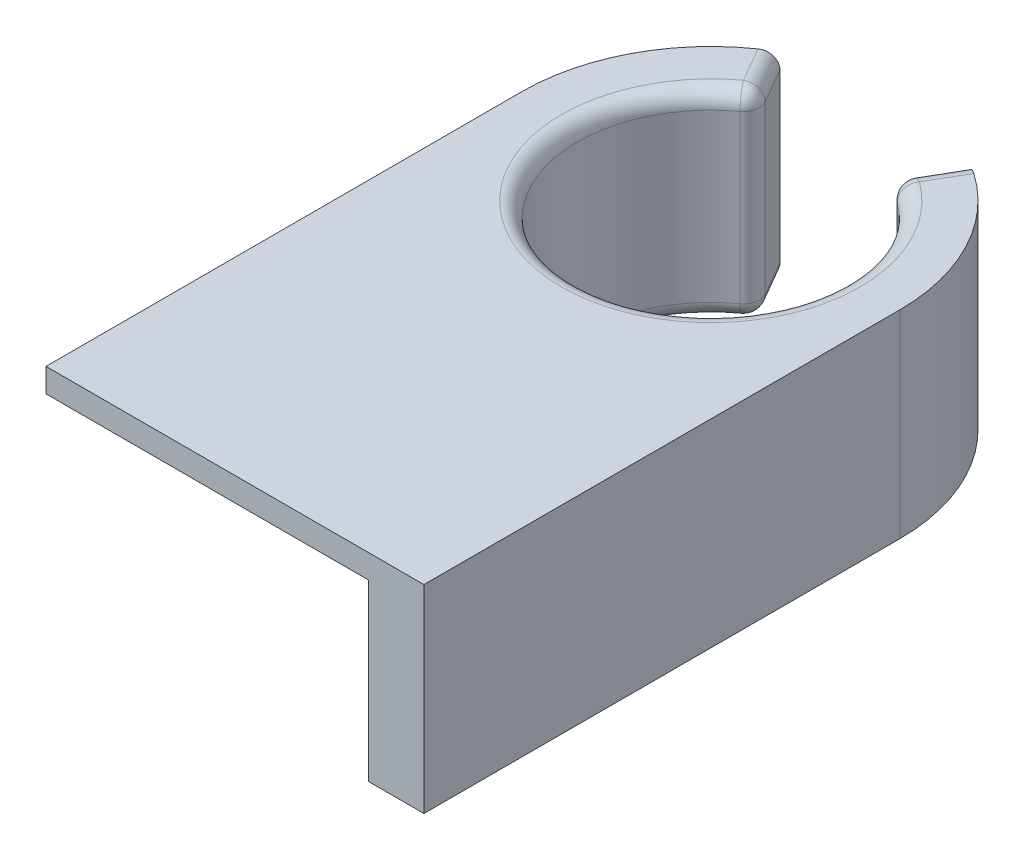
ISO-10303-21;
HEADER;
FILE_DESCRIPTION(('STEP AP214'),'2;1');
FILE_NAME('part.step','',(''),(''),'','','');
FILE_SCHEMA(('AUTOMOTIVE_DESIGN { 1 0 10303 214 1 1 1 1 }'));
ENDSEC;
DATA;
#1=APPLICATION_CONTEXT('core data for automotive mechanical design processes');
#2=APPLICATION_PROTOCOL_DEFINITION('international standard','automotive_design',2000,#1);
#3=PRODUCT_CONTEXT('',#1,'mechanical');
#4=PRODUCT('Part','Part','',(#3));
#5=PRODUCT_RELATED_PRODUCT_CATEGORY('part','',(#4));
#6=PRODUCT_DEFINITION_FORMATION('','',#4);
#7=PRODUCT_DEFINITION_CONTEXT('part definition',#1,'design');
#8=PRODUCT_DEFINITION('design','',#6,#7);
#9=PRODUCT_DEFINITION_SHAPE('','',#8);
#10=(LENGTH_UNIT() NAMED_UNIT(*) SI_UNIT(.MILLI.,.METRE.));
#11=(NAMED_UNIT(*) PLANE_ANGLE_UNIT() SI_UNIT($,.RADIAN.));
#12=(NAMED_UNIT(*) SI_UNIT($,.STERADIAN.) SOLID_ANGLE_UNIT());
#13=UNCERTAINTY_MEASURE_WITH_UNIT(LENGTH_MEASURE(1.E-05),#10,'distance_accuracy_value','');
#14=(GEOMETRIC_REPRESENTATION_CONTEXT(3) GLOBAL_UNCERTAINTY_ASSIGNED_CONTEXT((#13)) GLOBAL_UNIT_ASSIGNED_CONTEXT((#10,
#11,#12)) REPRESENTATION_CONTEXT('',''));
#15=CARTESIAN_POINT('',(0.,0.,0.));
#16=DIRECTION('',(0.,0.,1.));
#17=DIRECTION('',(1.,0.,0.));
#18=AXIS2_PLACEMENT_3D('',#15,#16,#17);
#19=CARTESIAN_POINT('',(0.,25.,0.));
#20=DIRECTION('',(0.,-1.,0.));
#21=DIRECTION('',(0.,0.,-1.));
#22=AXIS2_PLACEMENT_3D('',#19,#20,#21);
#23=CYLINDRICAL_SURFACE('',#22,23.8275);
#24=CARTESIAN_POINT('',(0.,25.,0.));
#25=DIRECTION('',(0.,1.,0.));
#26=DIRECTION('',(0.,0.,1.));
#27=AXIS2_PLACEMENT_3D('',#24,#25,#26);
#28=CIRCLE('',#27,23.8275);
#29=CARTESIAN_POINT('',(-13.6037583116519,25.,-19.5624005696684));
#30=VERTEX_POINT('',#29);
#31=CARTESIAN_POINT('',(-23.8275,25.,1.6638654320257E-13));
#32=VERTEX_POINT('',#31);
#33=EDGE_CURVE('E253',#30,#32,#28,.T.);
#34=ORIENTED_EDGE('',*,*,#33,.F.);
#35=CARTESIAN_POINT('',(-13.6037583116519,25.,-19.5624005696684));
#36=CARTESIAN_POINT('',(-13.5575772462199,24.9999996346999,-19.594516376713));
#37=CARTESIAN_POINT('',(-13.5113026803876,24.997642113347,-19.6264515947386));
#38=CARTESIAN_POINT('',(-13.4188576270536,24.9882285596995,-19.6897726748416));
#39=CARTESIAN_POINT('',(-13.3726871369803,24.9811726448012,-19.7211585506252));
#40=CARTESIAN_POINT('',(-13.2349123051829,24.9530109636435,-19.8141128594237));
#41=CARTESIAN_POINT('',(-13.1438946776167,24.924911134737,-19.8745821423708));
#42=CARTESIAN_POINT('',(-12.9663012669855,24.85078591658,-19.9909003303027));
#43=CARTESIAN_POINT('',(-12.8797281462278,24.8047499219538,-20.0467464779683));
#44=CARTESIAN_POINT('',(-12.7136814181872,24.6960408797662,-20.1524626180716));
#45=CARTESIAN_POINT('',(-12.6342063097434,24.6333713612226,-20.2023338749062));
#46=CARTESIAN_POINT('',(-12.484960572036,24.4932969970803,-20.2949065264269));
#47=CARTESIAN_POINT('',(-12.4151722410985,24.4159196587558,-20.3376210298099));
#48=CARTESIAN_POINT('',(-12.2872980860975,24.248524534077,-20.4151332911205));
#49=CARTESIAN_POINT('',(-12.2292147157592,24.1585041040338,-20.4499293893004));
#50=CARTESIAN_POINT('',(-12.1265635163451,23.9683041661146,-20.510967716837));
#51=CARTESIAN_POINT('',(-12.0820091591658,23.8681146636583,-20.5372014218825));
#52=CARTESIAN_POINT('',(-12.0079378677457,23.6605030597029,-20.5805985828272));
#53=CARTESIAN_POINT('',(-11.9784123864129,23.5530851085507,-20.5977671943557));
#54=CARTESIAN_POINT('',(-11.942551038963,23.3708640523362,-20.6185718432068));
#55=CARTESIAN_POINT('',(-11.9317598305681,23.2971936337727,-20.6248147350633));
#56=CARTESIAN_POINT('',(-11.9173588510578,23.1490256754823,-20.6331367803596));
#57=CARTESIAN_POINT('',(-11.9137391101299,23.0745294290139,-20.6352217142415));
#58=CARTESIAN_POINT('',(-11.91375,23.,-20.6352203086737));
#59=B_SPLINE_CURVE_WITH_KNOTS('',3,(#35,#36,#37,#38,#39,#40,#41,#42,#43,#44,#45,#46,#47,#48,#49,
#50,#51,#52,#53,#54,#55,#56,#57,#58),.UNSPECIFIED.,.F.,.F.,(4,2,2,2,2,2,2,2,2,2,2,4),(0.,
0.168648988617177,0.337293763445205,0.674042585233094,1.01099082428119,1.3478676324548,
1.68412048855518,2.02044376058942,2.35710084596817,2.69356625612903,2.91728429674187,
3.14069110448448),.UNSPECIFIED.);
#60=CARTESIAN_POINT('',(-11.91375,23.,-20.6352203086737));
#61=VERTEX_POINT('',#60);
#62=EDGE_CURVE('E344',#30,#61,#59,.T.);
#63=ORIENTED_EDGE('',*,*,#62,.T.);
#64=DIRECTION('',(0.,-1.,0.));
#65=VECTOR('',#64,1.);
#66=CARTESIAN_POINT('',(-11.91375,25.,-20.6352203086737));
#67=LINE('',#66,#65);
#68=CARTESIAN_POINT('',(-11.91375,2.,-20.6352203086737));
#69=VERTEX_POINT('',#68);
#70=EDGE_CURVE('E248',#61,#69,#67,.T.);
#71=ORIENTED_EDGE('',*,*,#70,.T.);
#72=CARTESIAN_POINT('',(-11.91375,2.,-20.6352203086737));
#73=CARTESIAN_POINT('',(-11.9137497505257,1.94373441692322,-20.635219127095));
#74=CARTESIAN_POINT('',(-11.9158076122109,1.88749578832036,-20.6340324947129));
#75=CARTESIAN_POINT('',(-11.9240135262355,1.77542089410318,-20.6292920573971));
#76=CARTESIAN_POINT('',(-11.9301613835916,1.71958460943611,-20.6257383653087));
#77=CARTESIAN_POINT('',(-11.9546744202638,1.55337542423605,-20.6115476264077));
#78=CARTESIAN_POINT('',(-11.9791092549424,1.44411572703118,-20.5973808763792));
#79=CARTESIAN_POINT('',(-12.0433906559369,1.23189144655709,-20.5598605644135));
#80=CARTESIAN_POINT('',(-12.0832446799909,1.12892993745816,-20.5365025568839));
#81=CARTESIAN_POINT('',(-12.1770768769999,0.932227709445638,-20.4810037417134));
#82=CARTESIAN_POINT('',(-12.2310525775673,0.83848538041003,-20.4488644714303));
#83=CARTESIAN_POINT('',(-12.3513872819811,0.662912424181276,-20.3764055896631));
#84=CARTESIAN_POINT('',(-12.4177425107485,0.581078179179326,-20.336088471649));
#85=CARTESIAN_POINT('',(-12.5607649855103,0.431595313806597,-20.2480609989878));
#86=CARTESIAN_POINT('',(-12.6374339408662,0.363949049669216,-20.2003494186081));
#87=CARTESIAN_POINT('',(-12.7985847261315,0.244843735507754,-20.0986329432332));
#88=CARTESIAN_POINT('',(-12.8830582742553,0.193367776085821,-20.044634703801));
#89=CARTESIAN_POINT('',(-13.0572909832786,0.1079626368328,-19.9315745394946));
#90=CARTESIAN_POINT('',(-13.1470472780211,0.0740240380873792,-19.8725153526523));
#91=CARTESIAN_POINT('',(-13.2984336574901,0.0329095945440859,-19.771360693813));
#92=CARTESIAN_POINT('',(-13.3593664582312,0.0205712158048701,-19.7302432398722));
#93=CARTESIAN_POINT('',(-13.4815122174821,0.00411726965042726,-19.6469869416336));
#94=CARTESIAN_POINT('',(-13.5427246420613,-1.01875613908136E-05,-19.6048496637789));
#95=CARTESIAN_POINT('',(-13.6037583116519,0.,-19.5624005696684));
#96=B_SPLINE_CURVE_WITH_KNOTS('',3,(#72,#73,#74,#75,#76,#77,#78,#79,#80,#81,#82,#83,#84,#85,#86,
#87,#88,#89,#90,#91,#92,#93,#94,#95),.UNSPECIFIED.,.F.,.F.,(4,2,2,2,2,2,2,2,2,2,2,4),(0.,
0.16869307869546,0.337378115833044,0.674195912697411,1.01117682095581,1.34809877087581,
1.68491814547269,2.02179341229016,2.35831522455545,2.69465611032584,2.91783447749495,
3.14068943607577),.UNSPECIFIED.);
#97=CARTESIAN_POINT('',(-13.6037583116519,0.,-19.5624005696684));
#98=VERTEX_POINT('',#97);
#99=EDGE_CURVE('E337',#69,#98,#96,.T.);
#100=ORIENTED_EDGE('',*,*,#99,.T.);
#101=CARTESIAN_POINT('',(0.,0.,0.));
#102=DIRECTION('',(0.,1.,0.));
#103=DIRECTION('',(0.,0.,1.));
#104=AXIS2_PLACEMENT_3D('',#101,#102,#103);
#105=CIRCLE('',#104,23.8275);
#106=CARTESIAN_POINT('',(9.77607341080565,0.,21.7296604878341));
#107=VERTEX_POINT('',#106);
#108=EDGE_CURVE('E258',#98,#107,#105,.T.);
#109=ORIENTED_EDGE('',*,*,#108,.T.);
#110=DIRECTION('',(0.,-1.,0.));
#111=VECTOR('',#110,1.);
#112=CARTESIAN_POINT('',(9.77607341080565,25.,21.7296604878341));
#113=LINE('',#112,#111);
#114=CARTESIAN_POINT('',(9.77607341080565,22.,21.7296604878341));
#115=VERTEX_POINT('',#114);
#116=EDGE_CURVE('E264',#107,#115,#113,.F.);
#117=ORIENTED_EDGE('',*,*,#116,.T.);
#118=CARTESIAN_POINT('',(0.,22.,0.));
#119=DIRECTION('',(0.,1.,0.));
#120=DIRECTION('',(0.,0.,1.));
#121=AXIS2_PLACEMENT_3D('',#118,#119,#120);
#122=CIRCLE('',#121,23.8275);
#123=CARTESIAN_POINT('',(-23.8275,22.,1.6638654320257E-13));
#124=VERTEX_POINT('',#123);
#125=EDGE_CURVE('E192',#124,#115,#122,.T.);
#126=ORIENTED_EDGE('',*,*,#125,.F.);
#127=DIRECTION('',(0.,1.,0.));
#128=VECTOR('',#127,1.);
#129=CARTESIAN_POINT('',(-23.8275,22.,1.6638654320257E-13));
#130=LINE('',#129,#128);
#131=EDGE_CURVE('E191',#124,#32,#130,.T.);
#132=ORIENTED_EDGE('',*,*,#131,.T.);
#133=EDGE_LOOP('',(#34,#63,#71,#100,#109,#117,#126,#132));
#134=FACE_BOUND('',#133,.T.);
#135=ADVANCED_FACE('F58',(#134),#23,.T.);
#136=CARTESIAN_POINT('',(16.8275,25.,60.));
#137=DIRECTION('',(1.,0.,0.));
#138=DIRECTION('',(0.,1.,0.));
#139=AXIS2_PLACEMENT_3D('',#136,#137,#138);
#140=PLANE('',#139);
#141=DIRECTION('',(0.,0.,1.));
#142=VECTOR('',#141,1.);
#143=CARTESIAN_POINT('',(16.8275,22.,0.));
#144=LINE('',#143,#142);
#145=CARTESIAN_POINT('',(16.8275,22.,26.289446551801));
#146=VERTEX_POINT('',#145);
#147=CARTESIAN_POINT('',(16.8275,22.,60.));
#148=VERTEX_POINT('',#147);
#149=EDGE_CURVE('E201',#146,#148,#144,.T.);
#150=ORIENTED_EDGE('',*,*,#149,.F.);
#151=DIRECTION('',(0.,1.,0.));
#152=VECTOR('',#151,1.);
#153=CARTESIAN_POINT('',(16.8275,0.,26.289446551801));
#154=LINE('',#153,#152);
#155=CARTESIAN_POINT('',(16.8275,0.,26.289446551801));
#156=VERTEX_POINT('',#155);
#157=EDGE_CURVE('E256',#146,#156,#154,.F.);
#158=ORIENTED_EDGE('',*,*,#157,.T.);
#159=DIRECTION('',(0.,0.,-1.));
#160=VECTOR('',#159,1.);
#161=CARTESIAN_POINT('',(16.8275,0.,60.));
#162=LINE('',#161,#160);
#163=CARTESIAN_POINT('',(16.8275,0.,60.));
#164=VERTEX_POINT('',#163);
#165=EDGE_CURVE('E237',#164,#156,#162,.T.);
#166=ORIENTED_EDGE('',*,*,#165,.F.);
#167=DIRECTION('',(0.,-1.,0.));
#168=VECTOR('',#167,1.);
#169=CARTESIAN_POINT('',(16.8275,25.,60.));
#170=LINE('',#169,#168);
#171=EDGE_CURVE('E225',#148,#164,#170,.T.);
#172=ORIENTED_EDGE('',*,*,#171,.F.);
#173=EDGE_LOOP('',(#150,#158,#166,#172));
#174=FACE_BOUND('',#173,.T.);
#175=ADVANCED_FACE('F326',(#174),#140,.F.);
#176=DIRECTION('',(0.,-1.,0.));
#177=VECTOR('',#176,1.);
#178=CARTESIAN_POINT('',(11.91375,25.,-20.6352203086737));
#179=LINE('',#178,#177);
#180=CARTESIAN_POINT('',(11.91375,23.,-20.6352203086737));
#181=VERTEX_POINT('',#180);
#182=CARTESIAN_POINT('',(11.91375,2.,-20.6352203086737));
#183=VERTEX_POINT('',#182);
#184=EDGE_CURVE('E244',#181,#183,#179,.T.);
#185=ORIENTED_EDGE('',*,*,#184,.F.);
#186=CARTESIAN_POINT('',(11.91375,23.,-20.6352203086737));
#187=CARTESIAN_POINT('',(11.9137497505257,23.0562655830768,-20.6352191270951));
#188=CARTESIAN_POINT('',(11.9158076122109,23.1125042116796,-20.6340324947129));
#189=CARTESIAN_POINT('',(11.9240135262354,23.2245791058968,-20.6292920573971));
#190=CARTESIAN_POINT('',(11.9301613835916,23.2804153905639,-20.6257383653087));
#191=CARTESIAN_POINT('',(11.9546744202638,23.4466245757639,-20.6115476264078));
#192=CARTESIAN_POINT('',(11.9791092549424,23.5558842729688,-20.5973808763792));
#193=CARTESIAN_POINT('',(12.0433906559369,23.7681085534429,-20.5598605644135));
#194=CARTESIAN_POINT('',(12.0832446799909,23.8710700625418,-20.5365025568839));
#195=CARTESIAN_POINT('',(12.1770768769999,24.0677722905544,-20.4810037417134));
#196=CARTESIAN_POINT('',(12.2310525775673,24.16151461959,-20.4488644714303));
#197=CARTESIAN_POINT('',(12.351387281981,24.3370875758187,-20.3764055896631));
#198=CARTESIAN_POINT('',(12.4177425107485,24.4189218208207,-20.3360884716491));
#199=CARTESIAN_POINT('',(12.5607649855103,24.5684046861934,-20.2480609989878));
#200=CARTESIAN_POINT('',(12.6374339408662,24.6360509503308,-20.2003494186081));
#201=CARTESIAN_POINT('',(12.7985847261315,24.7551562644922,-20.0986329432333));
#202=CARTESIAN_POINT('',(12.8830582742553,24.8066322239142,-20.044634703801));
#203=CARTESIAN_POINT('',(13.0572909832786,24.8920373631672,-19.9315745394947));
#204=CARTESIAN_POINT('',(13.147047278021,24.9259759619126,-19.8725153526523));
#205=CARTESIAN_POINT('',(13.2984336574901,24.9670904054559,-19.771360693813));
#206=CARTESIAN_POINT('',(13.3593664582312,24.9794287841951,-19.7302432398722));
#207=CARTESIAN_POINT('',(13.4815122174821,24.9958827303496,-19.6469869416336));
#208=CARTESIAN_POINT('',(13.5427246420613,25.0000101875614,-19.6048496637789));
#209=CARTESIAN_POINT('',(13.6037583116519,25.,-19.5624005696684));
#210=B_SPLINE_CURVE_WITH_KNOTS('',3,(#186,#187,#188,#189,#190,#191,#192,#193,#194,#195,#196,
#197,#198,#199,#200,#201,#202,#203,#204,#205,#206,#207,#208,#209),.UNSPECIFIED.,.F.,.F.,(4,2,2,
2,2,2,2,2,2,2,2,4),(0.,0.168693078695456,0.33737811583304,0.674195912697411,1.01117682095581,
1.34809877087581,1.68491814547269,2.02179341229016,2.35831522455545,2.69465611032584,
2.91783447749495,3.14068943607577),.UNSPECIFIED.);
#211=CARTESIAN_POINT('',(13.6037583116519,25.,-19.5624005696684));
#212=VERTEX_POINT('',#211);
#213=EDGE_CURVE('E309',#181,#212,#210,.T.);
#214=ORIENTED_EDGE('',*,*,#213,.T.);
#215=CARTESIAN_POINT('',(23.8275,25.,0.));
#216=VERTEX_POINT('',#215);
#217=EDGE_CURVE('E257',#216,#212,#28,.T.);
#218=ORIENTED_EDGE('',*,*,#217,.F.);
#219=DIRECTION('',(0.,1.,0.));
#220=VECTOR('',#219,1.);
#221=CARTESIAN_POINT('',(23.8275,25.,0.));
#222=LINE('',#221,#220);
#223=CARTESIAN_POINT('',(23.8275,0.,0.));
#224=VERTEX_POINT('',#223);
#225=EDGE_CURVE('E218',#224,#216,#222,.T.);
#226=ORIENTED_EDGE('',*,*,#225,.F.);
#227=CARTESIAN_POINT('',(13.6037583116519,0.,-19.5624005696684));
#228=VERTEX_POINT('',#227);
#229=EDGE_CURVE('E252',#224,#228,#105,.T.);
#230=ORIENTED_EDGE('',*,*,#229,.T.);
#231=CARTESIAN_POINT('',(13.6037583116519,0.,-19.5624005696684));
#232=CARTESIAN_POINT('',(13.5575772462199,3.65300100909851E-07,-19.594516376713));
#233=CARTESIAN_POINT('',(13.5113026803876,0.00235788665297931,-19.6264515947386));
#234=CARTESIAN_POINT('',(13.4188576270536,0.0117714403005352,-19.6897726748416));
#235=CARTESIAN_POINT('',(13.3726871369803,0.0188273551988214,-19.7211585506252));
#236=CARTESIAN_POINT('',(13.2349123051829,0.046989036356491,-19.8141128594237));
#237=CARTESIAN_POINT('',(13.1438946776167,0.0750888652630106,-19.8745821423708));
#238=CARTESIAN_POINT('',(12.9663012669855,0.14921408341999,-19.9909003303027));
#239=CARTESIAN_POINT('',(12.8797281462278,0.195250078046158,-20.0467464779683));
#240=CARTESIAN_POINT('',(12.7136814181872,0.303959120233785,-20.1524626180716));
#241=CARTESIAN_POINT('',(12.6342063097434,0.366628638777371,-20.2023338749062));
#242=CARTESIAN_POINT('',(12.484960572036,0.506703002919652,-20.2949065264269));
#243=CARTESIAN_POINT('',(12.4151722410984,0.584080341244149,-20.3376210298099));
#244=CARTESIAN_POINT('',(12.2872980860975,0.751475465922984,-20.4151332911205));
#245=CARTESIAN_POINT('',(12.2292147157592,0.841495895966218,-20.4499293893004));
#246=CARTESIAN_POINT('',(12.126563516345,1.03169583388539,-20.510967716837));
#247=CARTESIAN_POINT('',(12.0820091591658,1.13188533634173,-20.5372014218825));
#248=CARTESIAN_POINT('',(12.0079378677457,1.3394969402971,-20.5805985828272));
#249=CARTESIAN_POINT('',(11.9784123864128,1.44691489144927,-20.5977671943557));
#250=CARTESIAN_POINT('',(11.942551038963,1.62913594766382,-20.6185718432068));
#251=CARTESIAN_POINT('',(11.9317598305681,1.70280636622727,-20.6248147350633));
#252=CARTESIAN_POINT('',(11.9173588510578,1.85097432451769,-20.6331367803596));
#253=CARTESIAN_POINT('',(11.9137391101299,1.92547057098613,-20.6352217142416));
#254=CARTESIAN_POINT('',(11.91375,2.,-20.6352203086737));
#255=B_SPLINE_CURVE_WITH_KNOTS('',3,(#231,#232,#233,#234,#235,#236,#237,#238,#239,#240,#241,
#242,#243,#244,#245,#246,#247,#248,#249,#250,#251,#252,#253,#254),.UNSPECIFIED.,.F.,.F.,(4,2,2,
2,2,2,2,2,2,2,2,4),(0.,0.168648988617179,0.337293763445205,0.674042585233094,1.01099082428118,
1.3478676324548,1.68412048855517,2.02044376058942,2.35710084596817,2.69356625612902,
2.91728429674187,3.14069110448448),.UNSPECIFIED.);
#256=EDGE_CURVE('E300',#228,#183,#255,.T.);
#257=ORIENTED_EDGE('',*,*,#256,.T.);
#258=EDGE_LOOP('',(#185,#214,#218,#226,#230,#257));
#259=FACE_BOUND('',#258,.T.);
#260=ADVANCED_FACE('F320',(#259),#23,.T.);
#261=CARTESIAN_POINT('',(0.,25.,0.));
#262=DIRECTION('',(0.,1.,0.));
#263=DIRECTION('',(0.,0.,1.));
#264=AXIS2_PLACEMENT_3D('',#261,#262,#263);
#265=PLANE('',#264);
#266=ORIENTED_EDGE('',*,*,#217,.T.);
#267=DIRECTION('',(0.500000000000001,0.,-0.866025403784438));
#268=VECTOR('',#267,1.);
#269=CARTESIAN_POINT('',(1.73205080756888,25.,1.));
#270=LINE('',#269,#268);
#271=CARTESIAN_POINT('',(11.0925363218197,25.,-15.212836494195));
#272=VERTEX_POINT('',#271);
#273=EDGE_CURVE('E392',#212,#272,#270,.F.);
#274=ORIENTED_EDGE('',*,*,#273,.T.);
#275=CARTESIAN_POINT('',(0.,25.,0.));
#276=DIRECTION('',(0.,1.,0.));
#277=DIRECTION('',(0.,0.,1.));
#278=AXIS2_PLACEMENT_3D('',#275,#276,#277);
#279=CIRCLE('',#278,18.8275);
#280=CARTESIAN_POINT('',(-11.0925363218198,25.,-15.2128364941949));
#281=VERTEX_POINT('',#280);
#282=EDGE_CURVE('E286',#272,#281,#279,.F.);
#283=ORIENTED_EDGE('',*,*,#282,.T.);
#284=DIRECTION('',(-0.500000000000001,0.,-0.866025403784438));
#285=VECTOR('',#284,1.);
#286=CARTESIAN_POINT('',(-13.6458008075689,25.,-19.6352203086737));
#287=LINE('',#286,#285);
#288=EDGE_CURVE('E387',#281,#30,#287,.T.);
#289=ORIENTED_EDGE('',*,*,#288,.T.);
#290=ORIENTED_EDGE('',*,*,#33,.T.);
#291=DIRECTION('',(0.,0.,1.));
#292=VECTOR('',#291,1.);
#293=CARTESIAN_POINT('',(-23.8275,25.,0.));
#294=LINE('',#293,#292);
#295=CARTESIAN_POINT('',(-23.8275,25.,60.));
#296=VERTEX_POINT('',#295);
#297=EDGE_CURVE('E207',#32,#296,#294,.T.);
#298=ORIENTED_EDGE('',*,*,#297,.T.);
#299=DIRECTION('',(-1.,0.,0.));
#300=VECTOR('',#299,1.);
#301=CARTESIAN_POINT('',(23.8275,25.,60.));
#302=LINE('',#301,#300);
#303=CARTESIAN_POINT('',(23.8275,25.,60.));
#304=VERTEX_POINT('',#303);
#305=EDGE_CURVE('E185',#304,#296,#302,.T.);
#306=ORIENTED_EDGE('',*,*,#305,.F.);
#307=DIRECTION('',(0.,0.,-1.));
#308=VECTOR('',#307,1.);
#309=CARTESIAN_POINT('',(23.8275,25.,60.));
#310=LINE('',#309,#308);
#311=EDGE_CURVE('E241',#304,#216,#310,.T.);
#312=ORIENTED_EDGE('',*,*,#311,.T.);
#313=EDGE_LOOP('',(#266,#274,#283,#289,#290,#298,#306,#312));
#314=FACE_BOUND('',#313,.T.);
#315=ADVANCED_FACE('F325',(#314),#265,.T.);
#316=CARTESIAN_POINT('',(0.,0.,0.));
#317=DIRECTION('',(0.,1.,0.));
#318=DIRECTION('',(0.,0.,1.));
#319=AXIS2_PLACEMENT_3D('',#316,#317,#318);
#320=PLANE('',#319);
#321=CARTESIAN_POINT('',(0.,0.,0.));
#322=DIRECTION('',(0.,1.,0.));
#323=DIRECTION('',(0.,0.,1.));
#324=AXIS2_PLACEMENT_3D('',#321,#322,#323);
#325=CIRCLE('',#324,18.8275);
#326=CARTESIAN_POINT('',(-11.0925363218198,0.,-15.2128364941949));
#327=VERTEX_POINT('',#326);
#328=CARTESIAN_POINT('',(11.0925363218197,0.,-15.212836494195));
#329=VERTEX_POINT('',#328);
#330=EDGE_CURVE('E274',#327,#329,#325,.T.);
#331=ORIENTED_EDGE('',*,*,#330,.T.);
#332=DIRECTION('',(0.500000000000001,0.,-0.866025403784438));
#333=VECTOR('',#332,1.);
#334=CARTESIAN_POINT('',(13.6458008075689,0.,-19.6352203086737));
#335=LINE('',#334,#333);
#336=EDGE_CURVE('E406',#329,#228,#335,.T.);
#337=ORIENTED_EDGE('',*,*,#336,.T.);
#338=ORIENTED_EDGE('',*,*,#229,.F.);
#339=DIRECTION('',(0.,0.,-1.));
#340=VECTOR('',#339,1.);
#341=CARTESIAN_POINT('',(23.8275,0.,60.));
#342=LINE('',#341,#340);
#343=CARTESIAN_POINT('',(23.8275,0.,60.));
#344=VERTEX_POINT('',#343);
#345=EDGE_CURVE('E231',#344,#224,#342,.T.);
#346=ORIENTED_EDGE('',*,*,#345,.F.);
#347=DIRECTION('',(1.,0.,0.));
#348=VECTOR('',#347,1.);
#349=CARTESIAN_POINT('',(23.8275,0.,60.));
#350=LINE('',#349,#348);
#351=EDGE_CURVE('E228',#164,#344,#350,.T.);
#352=ORIENTED_EDGE('',*,*,#351,.F.);
#353=ORIENTED_EDGE('',*,*,#165,.T.);
#354=CARTESIAN_POINT('',(11.8275,0.,26.289446551801));
#355=DIRECTION('',(0.,1.,0.));
#356=DIRECTION('',(0.,0.,1.));
#357=AXIS2_PLACEMENT_3D('',#354,#355,#356);
#358=CIRCLE('',#357,5.);
#359=EDGE_CURVE('E270',#156,#107,#358,.T.);
#360=ORIENTED_EDGE('',*,*,#359,.T.);
#361=ORIENTED_EDGE('',*,*,#108,.F.);
#362=DIRECTION('',(-0.500000000000001,0.,-0.866025403784438));
#363=VECTOR('',#362,1.);
#364=CARTESIAN_POINT('',(-1.73205080756887,0.,1.));
#365=LINE('',#364,#363);
#366=EDGE_CURVE('E403',#98,#327,#365,.F.);
#367=ORIENTED_EDGE('',*,*,#366,.T.);
#368=EDGE_LOOP('',(#331,#337,#338,#346,#352,#353,#360,#361,#367));
#369=FACE_BOUND('',#368,.T.);
#370=ADVANCED_FACE('F328',(#369),#320,.F.);
#371=CARTESIAN_POINT('',(0.,25.,0.));
#372=DIRECTION('',(-0.866025403784438,0.,0.500000000000001));
#373=DIRECTION('',(0.500000000000001,0.,0.866025403784438));
#374=AXIS2_PLACEMENT_3D('',#371,#372,#373);
#375=PLANE('',#374);
#376=ORIENTED_EDGE('',*,*,#70,.F.);
#377=DIRECTION('',(-0.500000000000001,0.,-0.866025403784438));
#378=VECTOR('',#377,1.);
#379=CARTESIAN_POINT('',(-9.41375000000003,23.,-16.3050932897515));
#380=LINE('',#379,#378);
#381=CARTESIAN_POINT('',(-9.36048551425087,23.,-16.2128364941949));
#382=VERTEX_POINT('',#381);
#383=EDGE_CURVE('E82',#61,#382,#380,.F.);
#384=ORIENTED_EDGE('',*,*,#383,.T.);
#385=DIRECTION('',(0.,1.,0.));
#386=VECTOR('',#385,1.);
#387=CARTESIAN_POINT('',(-9.36048551425087,2.,-16.2128364941949));
#388=LINE('',#387,#386);
#389=CARTESIAN_POINT('',(-9.36048551425087,2.,-16.2128364941949));
#390=VERTEX_POINT('',#389);
#391=EDGE_CURVE('E77',#382,#390,#388,.F.);
#392=ORIENTED_EDGE('',*,*,#391,.T.);
#393=DIRECTION('',(-0.500000000000001,0.,-0.866025403784438));
#394=VECTOR('',#393,1.);
#395=CARTESIAN_POINT('',(0.,2.,0.));
#396=LINE('',#395,#394);
#397=EDGE_CURVE('E468',#390,#69,#396,.T.);
#398=ORIENTED_EDGE('',*,*,#397,.T.);
#399=EDGE_LOOP('',(#376,#384,#392,#398));
#400=FACE_BOUND('',#399,.T.);
#401=ADVANCED_FACE('F471',(#400),#375,.F.);
#402=CARTESIAN_POINT('',(0.,25.,0.));
#403=DIRECTION('',(0.,-1.,0.));
#404=DIRECTION('',(0.,0.,-1.));
#405=AXIS2_PLACEMENT_3D('',#402,#403,#404);
#406=CYLINDRICAL_SURFACE('',#405,16.8275);
#407=CARTESIAN_POINT('',(0.,23.,0.));
#408=DIRECTION('',(0.,1.,0.));
#409=DIRECTION('',(0.,0.,1.));
#410=AXIS2_PLACEMENT_3D('',#407,#408,#409);
#411=CIRCLE('',#410,16.8275);
#412=CARTESIAN_POINT('',(-9.91420289233418,23.,-13.5968134965378));
#413=VERTEX_POINT('',#412);
#414=CARTESIAN_POINT('',(9.91420289233418,23.,-13.5968134965378));
#415=VERTEX_POINT('',#414);
#416=EDGE_CURVE('E278',#413,#415,#411,.T.);
#417=ORIENTED_EDGE('',*,*,#416,.T.);
#418=DIRECTION('',(0.,-1.,0.));
#419=VECTOR('',#418,1.);
#420=CARTESIAN_POINT('',(9.91420289233418,25.,-13.5968134965378));
#421=LINE('',#420,#419);
#422=CARTESIAN_POINT('',(9.91420289233418,2.,-13.5968134965378));
#423=VERTEX_POINT('',#422);
#424=EDGE_CURVE('E12',#415,#423,#421,.T.);
#425=ORIENTED_EDGE('',*,*,#424,.T.);
#426=CARTESIAN_POINT('',(0.,2.,0.));
#427=DIRECTION('',(0.,1.,0.));
#428=DIRECTION('',(0.,0.,1.));
#429=AXIS2_PLACEMENT_3D('',#426,#427,#428);
#430=CIRCLE('',#429,16.8275);
#431=CARTESIAN_POINT('',(-9.91420289233418,2.,-13.5968134965378));
#432=VERTEX_POINT('',#431);
#433=EDGE_CURVE('E282',#423,#432,#430,.F.);
#434=ORIENTED_EDGE('',*,*,#433,.T.);
#435=DIRECTION('',(0.,-1.,0.));
#436=VECTOR('',#435,1.);
#437=CARTESIAN_POINT('',(-9.91420289233418,25.,-13.5968134965378));
#438=LINE('',#437,#436);
#439=EDGE_CURVE('E69',#432,#413,#438,.F.);
#440=ORIENTED_EDGE('',*,*,#439,.T.);
#441=EDGE_LOOP('',(#417,#425,#434,#440));
#442=FACE_BOUND('',#441,.T.);
#443=ADVANCED_FACE('F477',(#442),#406,.F.);
#444=CARTESIAN_POINT('',(0.,25.,0.));
#445=DIRECTION('',(-0.866025403784438,0.,-0.500000000000001));
#446=DIRECTION('',(-0.500000000000001,0.,0.866025403784438));
#447=AXIS2_PLACEMENT_3D('',#444,#445,#446);
#448=PLANE('',#447);
#449=DIRECTION('',(0.,-1.,0.));
#450=VECTOR('',#449,1.);
#451=CARTESIAN_POINT('',(9.36048551425086,25.,-16.2128364941949));
#452=LINE('',#451,#450);
#453=CARTESIAN_POINT('',(9.36048551425086,2.,-16.2128364941949));
#454=VERTEX_POINT('',#453);
#455=CARTESIAN_POINT('',(9.36048551425086,23.,-16.2128364941949));
#456=VERTEX_POINT('',#455);
#457=EDGE_CURVE('E290',#454,#456,#452,.F.);
#458=ORIENTED_EDGE('',*,*,#457,.T.);
#459=DIRECTION('',(0.500000000000001,0.,-0.866025403784438));
#460=VECTOR('',#459,1.);
#461=CARTESIAN_POINT('',(0.,23.,0.));
#462=LINE('',#461,#460);
#463=EDGE_CURVE('E296',#456,#181,#462,.T.);
#464=ORIENTED_EDGE('',*,*,#463,.T.);
#465=ORIENTED_EDGE('',*,*,#184,.T.);
#466=DIRECTION('',(0.500000000000001,0.,-0.866025403784438));
#467=VECTOR('',#466,1.);
#468=CARTESIAN_POINT('',(9.41375000000002,2.,-16.3050932897515));
#469=LINE('',#468,#467);
#470=EDGE_CURVE('E293',#183,#454,#469,.F.);
#471=ORIENTED_EDGE('',*,*,#470,.T.);
#472=EDGE_LOOP('',(#458,#464,#465,#471));
#473=FACE_BOUND('',#472,.T.);
#474=ADVANCED_FACE('F488',(#473),#448,.T.);
#475=CARTESIAN_POINT('',(23.8275,25.,60.));
#476=DIRECTION('',(-1.,0.,0.));
#477=DIRECTION('',(0.,0.,1.));
#478=AXIS2_PLACEMENT_3D('',#475,#476,#477);
#479=PLANE('',#478);
#480=ORIENTED_EDGE('',*,*,#225,.T.);
#481=ORIENTED_EDGE('',*,*,#311,.F.);
#482=DIRECTION('',(0.,1.,0.));
#483=VECTOR('',#482,1.);
#484=CARTESIAN_POINT('',(23.8275,25.,60.));
#485=LINE('',#484,#483);
#486=EDGE_CURVE('E220',#344,#304,#485,.T.);
#487=ORIENTED_EDGE('',*,*,#486,.F.);
#488=ORIENTED_EDGE('',*,*,#345,.T.);
#489=EDGE_LOOP('',(#480,#481,#487,#488));
#490=FACE_BOUND('',#489,.T.);
#491=ADVANCED_FACE('F530',(#490),#479,.F.);
#492=CARTESIAN_POINT('',(0.,0.,60.));
#493=DIRECTION('',(0.,0.,-1.));
#494=DIRECTION('',(-1.,0.,0.));
#495=AXIS2_PLACEMENT_3D('',#492,#493,#494);
#496=PLANE('',#495);
#497=ORIENTED_EDGE('',*,*,#486,.T.);
#498=ORIENTED_EDGE('',*,*,#305,.T.);
#499=DIRECTION('',(0.,1.,0.));
#500=VECTOR('',#499,1.);
#501=CARTESIAN_POINT('',(-23.8275,22.,60.));
#502=LINE('',#501,#500);
#503=CARTESIAN_POINT('',(-23.8275,22.,60.));
#504=VERTEX_POINT('',#503);
#505=EDGE_CURVE('E179',#504,#296,#502,.T.);
#506=ORIENTED_EDGE('',*,*,#505,.F.);
#507=DIRECTION('',(1.,0.,0.));
#508=VECTOR('',#507,1.);
#509=CARTESIAN_POINT('',(0.,22.,60.));
#510=LINE('',#509,#508);
#511=EDGE_CURVE('E183',#504,#148,#510,.T.);
#512=ORIENTED_EDGE('',*,*,#511,.T.);
#513=ORIENTED_EDGE('',*,*,#171,.T.);
#514=ORIENTED_EDGE('',*,*,#351,.T.);
#515=EDGE_LOOP('',(#497,#498,#506,#512,#513,#514));
#516=FACE_BOUND('',#515,.T.);
#517=ADVANCED_FACE('F182',(#516),#496,.F.);
#518=CARTESIAN_POINT('',(-23.8275,22.,0.));
#519=DIRECTION('',(-1.,0.,0.));
#520=DIRECTION('',(0.,0.,1.));
#521=AXIS2_PLACEMENT_3D('',#518,#519,#520);
#522=PLANE('',#521);
#523=ORIENTED_EDGE('',*,*,#297,.F.);
#524=ORIENTED_EDGE('',*,*,#131,.F.);
#525=DIRECTION('',(0.,0.,1.));
#526=VECTOR('',#525,1.);
#527=CARTESIAN_POINT('',(-23.8275,22.,0.));
#528=LINE('',#527,#526);
#529=EDGE_CURVE('E198',#124,#504,#528,.T.);
#530=ORIENTED_EDGE('',*,*,#529,.T.);
#531=ORIENTED_EDGE('',*,*,#505,.T.);
#532=EDGE_LOOP('',(#523,#524,#530,#531));
#533=FACE_BOUND('',#532,.T.);
#534=ADVANCED_FACE('F204',(#533),#522,.T.);
#535=CARTESIAN_POINT('',(0.,22.,0.));
#536=DIRECTION('',(0.,1.,0.));
#537=DIRECTION('',(0.,0.,1.));
#538=AXIS2_PLACEMENT_3D('',#535,#536,#537);
#539=PLANE('',#538);
#540=ORIENTED_EDGE('',*,*,#125,.T.);
#541=CARTESIAN_POINT('',(11.8275,22.,26.289446551801));
#542=DIRECTION('',(0.,1.,0.));
#543=DIRECTION('',(0.,0.,1.));
#544=AXIS2_PLACEMENT_3D('',#541,#542,#543);
#545=CIRCLE('',#544,5.);
#546=EDGE_CURVE('E267',#115,#146,#545,.F.);
#547=ORIENTED_EDGE('',*,*,#546,.T.);
#548=ORIENTED_EDGE('',*,*,#149,.T.);
#549=ORIENTED_EDGE('',*,*,#511,.F.);
#550=ORIENTED_EDGE('',*,*,#529,.F.);
#551=EDGE_LOOP('',(#540,#547,#548,#549,#550));
#552=FACE_BOUND('',#551,.T.);
#553=ADVANCED_FACE('F197',(#552),#539,.F.);
#554=CARTESIAN_POINT('',(11.8275,25.,26.289446551801));
#555=DIRECTION('',(0.,-1.,0.));
#556=DIRECTION('',(0.,0.,-1.));
#557=AXIS2_PLACEMENT_3D('',#554,#555,#556);
#558=CYLINDRICAL_SURFACE('',#557,5.);
#559=ORIENTED_EDGE('',*,*,#546,.F.);
#560=ORIENTED_EDGE('',*,*,#116,.F.);
#561=ORIENTED_EDGE('',*,*,#359,.F.);
#562=ORIENTED_EDGE('',*,*,#157,.F.);
#563=EDGE_LOOP('',(#559,#560,#561,#562));
#564=FACE_BOUND('',#563,.T.);
#565=ADVANCED_FACE('F330',(#564),#558,.F.);
#566=CARTESIAN_POINT('',(0.,2.,0.));
#567=DIRECTION('',(0.,1.,0.));
#568=DIRECTION('',(0.,0.,1.));
#569=AXIS2_PLACEMENT_3D('',#566,#567,#568);
#570=TOROIDAL_SURFACE('',#569,18.8275,2.);
#571=ORIENTED_EDGE('',*,*,#433,.F.);
#572=CARTESIAN_POINT('',(11.0925363218197,2.,-15.212836494195));
#573=DIRECTION('',(-0.808011498828573,0.,-0.589166714742783));
#574=DIRECTION('',(-0.589166714742783,0.,0.808011498828573));
#575=AXIS2_PLACEMENT_3D('',#572,#573,#574);
#576=CIRCLE('',#575,2.);
#577=EDGE_CURVE('E345',#423,#329,#576,.F.);
#578=ORIENTED_EDGE('',*,*,#577,.T.);
#579=ORIENTED_EDGE('',*,*,#330,.F.);
#580=CARTESIAN_POINT('',(-11.0925363218198,2.,-15.2128364941949));
#581=DIRECTION('',(-0.808011498828572,0.,0.589166714742783));
#582=DIRECTION('',(0.589166714742783,0.,0.808011498828572));
#583=AXIS2_PLACEMENT_3D('',#580,#581,#582);
#584=CIRCLE('',#583,2.);
#585=EDGE_CURVE('E408',#327,#432,#584,.T.);
#586=ORIENTED_EDGE('',*,*,#585,.T.);
#587=EDGE_LOOP('',(#571,#578,#579,#586));
#588=FACE_BOUND('',#587,.T.);
#589=ADVANCED_FACE('F415',(#588),#570,.T.);
#590=CARTESIAN_POINT('',(0.,23.,0.));
#591=DIRECTION('',(0.,1.,0.));
#592=DIRECTION('',(0.,0.,1.));
#593=AXIS2_PLACEMENT_3D('',#590,#591,#592);
#594=TOROIDAL_SURFACE('',#593,18.8275,2.);
#595=ORIENTED_EDGE('',*,*,#282,.F.);
#596=CARTESIAN_POINT('',(11.0925363218197,23.,-15.212836494195));
#597=DIRECTION('',(-0.808011498828573,0.,-0.589166714742783));
#598=DIRECTION('',(-0.589166714742783,0.,0.808011498828573));
#599=AXIS2_PLACEMENT_3D('',#596,#597,#598);
#600=CIRCLE('',#599,2.);
#601=EDGE_CURVE('E400',#272,#415,#600,.F.);
#602=ORIENTED_EDGE('',*,*,#601,.T.);
#603=ORIENTED_EDGE('',*,*,#416,.F.);
#604=CARTESIAN_POINT('',(-11.0925363218198,23.,-15.2128364941949));
#605=DIRECTION('',(-0.808011498828572,0.,0.589166714742783));
#606=DIRECTION('',(0.589166714742783,0.,0.808011498828572));
#607=AXIS2_PLACEMENT_3D('',#604,#605,#606);
#608=CIRCLE('',#607,2.);
#609=EDGE_CURVE('E395',#413,#281,#608,.T.);
#610=ORIENTED_EDGE('',*,*,#609,.T.);
#611=EDGE_LOOP('',(#595,#602,#603,#610));
#612=FACE_BOUND('',#611,.T.);
#613=ADVANCED_FACE('F480',(#612),#594,.T.);
#614=CARTESIAN_POINT('',(1.73205080756888,2.,1.));
#615=DIRECTION('',(-0.500000000000001,0.,0.866025403784438));
#616=DIRECTION('',(0.866025403784438,0.,0.500000000000001));
#617=AXIS2_PLACEMENT_3D('',#614,#615,#616);
#618=CYLINDRICAL_SURFACE('',#617,2.);
#619=ORIENTED_EDGE('',*,*,#256,.F.);
#620=ORIENTED_EDGE('',*,*,#336,.F.);
#621=CARTESIAN_POINT('',(11.0925363218197,2.,-15.2128364941949));
#622=DIRECTION('',(-0.5,0.,0.866025403784438));
#623=DIRECTION('',(0.866025403784438,0.,0.5));
#624=AXIS2_PLACEMENT_3D('',#621,#622,#623);
#625=CIRCLE('',#624,2.);
#626=EDGE_CURVE('E210',#454,#329,#625,.T.);
#627=ORIENTED_EDGE('',*,*,#626,.F.);
#628=ORIENTED_EDGE('',*,*,#470,.F.);
#629=EDGE_LOOP('',(#619,#620,#627,#628));
#630=FACE_BOUND('',#629,.T.);
#631=ADVANCED_FACE('F316',(#630),#618,.T.);
#632=CARTESIAN_POINT('',(11.0925363218197,2.,-15.212836494195));
#633=DIRECTION('',(-0.866025403784438,0.,-0.500000000000001));
#634=DIRECTION('',(-0.500000000000001,0.,0.866025403784438));
#635=AXIS2_PLACEMENT_3D('',#632,#633,#634);
#636=SPHERICAL_SURFACE('',#635,2.);
#637=ORIENTED_EDGE('',*,*,#626,.T.);
#638=ORIENTED_EDGE('',*,*,#577,.F.);
#639=CARTESIAN_POINT('',(11.0925363218197,2.,-15.212836494195));
#640=DIRECTION('',(0.,1.,0.));
#641=DIRECTION('',(0.,0.,1.));
#642=AXIS2_PLACEMENT_3D('',#639,#640,#641);
#643=CIRCLE('',#642,2.);
#644=EDGE_CURVE('E432',#454,#423,#643,.T.);
#645=ORIENTED_EDGE('',*,*,#644,.F.);
#646=EDGE_LOOP('',(#637,#638,#645));
#647=FACE_BOUND('',#646,.T.);
#648=ADVANCED_FACE('F431',(#647),#636,.T.);
#649=CARTESIAN_POINT('',(11.0925363218197,25.,-15.2128364941949));
#650=DIRECTION('',(0.,-1.,0.));
#651=DIRECTION('',(0.,0.,-1.));
#652=AXIS2_PLACEMENT_3D('',#649,#650,#651);
#653=CYLINDRICAL_SURFACE('',#652,2.);
#654=ORIENTED_EDGE('',*,*,#644,.T.);
#655=ORIENTED_EDGE('',*,*,#424,.F.);
#656=CARTESIAN_POINT('',(11.0925363218197,23.,-15.2128364941949));
#657=DIRECTION('',(0.,1.,0.));
#658=DIRECTION('',(0.,0.,1.));
#659=AXIS2_PLACEMENT_3D('',#656,#657,#658);
#660=CIRCLE('',#659,2.);
#661=EDGE_CURVE('E437',#456,#415,#660,.T.);
#662=ORIENTED_EDGE('',*,*,#661,.F.);
#663=ORIENTED_EDGE('',*,*,#457,.F.);
#664=EDGE_LOOP('',(#654,#655,#662,#663));
#665=FACE_BOUND('',#664,.T.);
#666=ADVANCED_FACE('F486',(#665),#653,.T.);
#667=CARTESIAN_POINT('',(11.0925363218197,23.,-15.212836494195));
#668=DIRECTION('',(-0.866025403784438,0.,-0.500000000000001));
#669=DIRECTION('',(-0.500000000000001,0.,0.866025403784438));
#670=AXIS2_PLACEMENT_3D('',#667,#668,#669);
#671=SPHERICAL_SURFACE('',#670,2.);
#672=ORIENTED_EDGE('',*,*,#661,.T.);
#673=ORIENTED_EDGE('',*,*,#601,.F.);
#674=CARTESIAN_POINT('',(11.0925363218197,23.,-15.212836494195));
#675=DIRECTION('',(0.500000000000001,0.,-0.866025403784438));
#676=DIRECTION('',(-0.866025403784438,0.,-0.500000000000001));
#677=AXIS2_PLACEMENT_3D('',#674,#675,#676);
#678=CIRCLE('',#677,2.);
#679=EDGE_CURVE('E454',#456,#272,#678,.T.);
#680=ORIENTED_EDGE('',*,*,#679,.F.);
#681=EDGE_LOOP('',(#672,#673,#680));
#682=FACE_BOUND('',#681,.T.);
#683=ADVANCED_FACE('F483',(#682),#671,.T.);
#684=CARTESIAN_POINT('',(1.73205080756888,23.,1.));
#685=DIRECTION('',(0.500000000000001,0.,-0.866025403784438));
#686=DIRECTION('',(-0.866025403784438,0.,-0.500000000000001));
#687=AXIS2_PLACEMENT_3D('',#684,#685,#686);
#688=CYLINDRICAL_SURFACE('',#687,2.);
#689=ORIENTED_EDGE('',*,*,#679,.T.);
#690=ORIENTED_EDGE('',*,*,#273,.F.);
#691=ORIENTED_EDGE('',*,*,#213,.F.);
#692=ORIENTED_EDGE('',*,*,#463,.F.);
#693=EDGE_LOOP('',(#689,#690,#691,#692));
#694=FACE_BOUND('',#693,.T.);
#695=ADVANCED_FACE('F372',(#694),#688,.T.);
#696=CARTESIAN_POINT('',(-1.73205080756888,2.,1.));
#697=DIRECTION('',(-0.500000000000001,0.,-0.866025403784438));
#698=DIRECTION('',(-0.866025403784438,0.,0.500000000000001));
#699=AXIS2_PLACEMENT_3D('',#696,#697,#698);
#700=CYLINDRICAL_SURFACE('',#699,2.);
#701=CARTESIAN_POINT('',(-11.0925363218198,2.,-15.2128364941949));
#702=DIRECTION('',(0.500000000000002,0.,0.866025403784437));
#703=DIRECTION('',(0.866025403784437,0.,-0.500000000000002));
#704=AXIS2_PLACEMENT_3D('',#701,#702,#703);
#705=CIRCLE('',#704,2.);
#706=EDGE_CURVE('E63',#327,#390,#705,.T.);
#707=ORIENTED_EDGE('',*,*,#706,.F.);
#708=ORIENTED_EDGE('',*,*,#366,.F.);
#709=ORIENTED_EDGE('',*,*,#99,.F.);
#710=ORIENTED_EDGE('',*,*,#397,.F.);
#711=EDGE_LOOP('',(#707,#708,#709,#710));
#712=FACE_BOUND('',#711,.T.);
#713=ADVANCED_FACE('F60',(#712),#700,.T.);
#714=CARTESIAN_POINT('',(-11.0925363218198,2.,-15.2128364941949));
#715=DIRECTION('',(-0.866025403784438,0.,0.500000000000001));
#716=DIRECTION('',(0.500000000000001,0.,0.866025403784438));
#717=AXIS2_PLACEMENT_3D('',#714,#715,#716);
#718=SPHERICAL_SURFACE('',#717,2.);
#719=ORIENTED_EDGE('',*,*,#585,.F.);
#720=ORIENTED_EDGE('',*,*,#706,.T.);
#721=CARTESIAN_POINT('',(-11.0925363218198,2.,-15.2128364941949));
#722=DIRECTION('',(0.,1.,0.));
#723=DIRECTION('',(0.,0.,1.));
#724=AXIS2_PLACEMENT_3D('',#721,#722,#723);
#725=CIRCLE('',#724,2.);
#726=EDGE_CURVE('E447',#432,#390,#725,.T.);
#727=ORIENTED_EDGE('',*,*,#726,.F.);
#728=EDGE_LOOP('',(#719,#720,#727));
#729=FACE_BOUND('',#728,.T.);
#730=ADVANCED_FACE('F365',(#729),#718,.T.);
#731=CARTESIAN_POINT('',(-11.0925363218197,25.,-15.2128364941949));
#732=DIRECTION('',(0.,-1.,0.));
#733=DIRECTION('',(0.,0.,-1.));
#734=AXIS2_PLACEMENT_3D('',#731,#732,#733);
#735=CYLINDRICAL_SURFACE('',#734,2.);
#736=CARTESIAN_POINT('',(-11.0925363218198,23.,-15.2128364941949));
#737=DIRECTION('',(0.,1.,0.));
#738=DIRECTION('',(0.,0.,1.));
#739=AXIS2_PLACEMENT_3D('',#736,#737,#738);
#740=CIRCLE('',#739,2.);
#741=EDGE_CURVE('E444',#413,#382,#740,.T.);
#742=ORIENTED_EDGE('',*,*,#741,.F.);
#743=ORIENTED_EDGE('',*,*,#439,.F.);
#744=ORIENTED_EDGE('',*,*,#726,.T.);
#745=ORIENTED_EDGE('',*,*,#391,.F.);
#746=EDGE_LOOP('',(#742,#743,#744,#745));
#747=FACE_BOUND('',#746,.T.);
#748=ADVANCED_FACE('F362',(#747),#735,.T.);
#749=CARTESIAN_POINT('',(-11.0925363218198,23.,-15.2128364941949));
#750=DIRECTION('',(-0.866025403784438,0.,0.500000000000001));
#751=DIRECTION('',(0.500000000000001,0.,0.866025403784438));
#752=AXIS2_PLACEMENT_3D('',#749,#750,#751);
#753=SPHERICAL_SURFACE('',#752,2.);
#754=ORIENTED_EDGE('',*,*,#609,.F.);
#755=ORIENTED_EDGE('',*,*,#741,.T.);
#756=CARTESIAN_POINT('',(-11.0925363218198,23.,-15.2128364941949));
#757=DIRECTION('',(-0.500000000000004,0.,-0.866025403784436));
#758=DIRECTION('',(-0.866025403784437,0.,0.500000000000004));
#759=AXIS2_PLACEMENT_3D('',#756,#757,#758);
#760=CIRCLE('',#759,2.);
#761=EDGE_CURVE('E441',#281,#382,#760,.T.);
#762=ORIENTED_EDGE('',*,*,#761,.F.);
#763=EDGE_LOOP('',(#754,#755,#762));
#764=FACE_BOUND('',#763,.T.);
#765=ADVANCED_FACE('F358',(#764),#753,.T.);
#766=CARTESIAN_POINT('',(-1.73205080756888,23.,1.));
#767=DIRECTION('',(0.500000000000001,0.,0.866025403784438));
#768=DIRECTION('',(0.866025403784438,0.,-0.500000000000001));
#769=AXIS2_PLACEMENT_3D('',#766,#767,#768);
#770=CYLINDRICAL_SURFACE('',#769,2.);
#771=ORIENTED_EDGE('',*,*,#761,.T.);
#772=ORIENTED_EDGE('',*,*,#383,.F.);
#773=ORIENTED_EDGE('',*,*,#62,.F.);
#774=ORIENTED_EDGE('',*,*,#288,.F.);
#775=EDGE_LOOP('',(#771,#772,#773,#774));
#776=FACE_BOUND('',#775,.T.);
#777=ADVANCED_FACE('F354',(#776),#770,.T.);
#778=CLOSED_SHELL('',(#135,#175,#260,#315,#370,#401,#443,#474,#491,#517,#534,#553,#565,#589,
#613,#631,#648,#666,#683,#695,#713,#730,#748,#765,#777));
#779=MANIFOLD_SOLID_BREP('B2',#778);
#780=ADVANCED_BREP_SHAPE_REPRESENTATION('',(#18,#779),#14);
#781=SHAPE_DEFINITION_REPRESENTATION(#9,#780);
ENDSEC;
END-ISO-10303-21;
